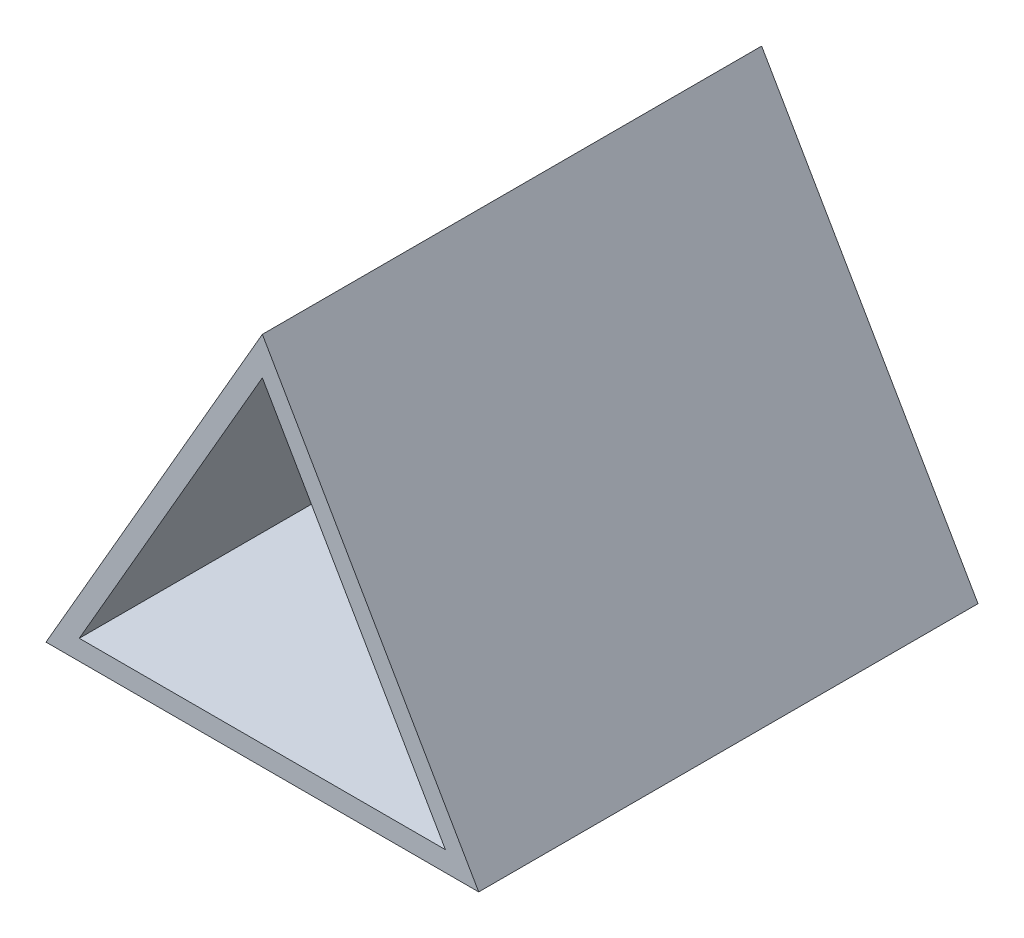
ISO-10303-21;
HEADER;
FILE_DESCRIPTION(('STEP AP214'),'2;1');
FILE_NAME('part.step','',(''),(''),'','','');
FILE_SCHEMA(('AUTOMOTIVE_DESIGN { 1 0 10303 214 1 1 1 1 }'));
ENDSEC;
DATA;
#1=APPLICATION_CONTEXT('core data for automotive mechanical design processes');
#2=APPLICATION_PROTOCOL_DEFINITION('international standard','automotive_design',2000,#1);
#3=PRODUCT_CONTEXT('',#1,'mechanical');
#4=PRODUCT('Part','Part','',(#3));
#5=PRODUCT_RELATED_PRODUCT_CATEGORY('part','',(#4));
#6=PRODUCT_DEFINITION_FORMATION('','',#4);
#7=PRODUCT_DEFINITION_CONTEXT('part definition',#1,'design');
#8=PRODUCT_DEFINITION('design','',#6,#7);
#9=PRODUCT_DEFINITION_SHAPE('','',#8);
#10=(LENGTH_UNIT() NAMED_UNIT(*) SI_UNIT(.MILLI.,.METRE.));
#11=(NAMED_UNIT(*) PLANE_ANGLE_UNIT() SI_UNIT($,.RADIAN.));
#12=(NAMED_UNIT(*) SI_UNIT($,.STERADIAN.) SOLID_ANGLE_UNIT());
#13=UNCERTAINTY_MEASURE_WITH_UNIT(LENGTH_MEASURE(1.E-05),#10,'distance_accuracy_value','');
#14=(GEOMETRIC_REPRESENTATION_CONTEXT(3) GLOBAL_UNCERTAINTY_ASSIGNED_CONTEXT((#13)) GLOBAL_UNIT_ASSIGNED_CONTEXT((#10,
#11,#12)) REPRESENTATION_CONTEXT('',''));
#15=CARTESIAN_POINT('',(0.,0.,0.));
#16=DIRECTION('',(0.,0.,1.));
#17=DIRECTION('',(1.,0.,0.));
#18=AXIS2_PLACEMENT_3D('',#15,#16,#17);
#19=CARTESIAN_POINT('',(-18.4720190424421,10.6648251666298,-75.));
#20=DIRECTION('',(0.866025403784439,-0.5,0.));
#21=DIRECTION('',(0.5,0.866025403784439,0.));
#22=AXIS2_PLACEMENT_3D('',#19,#20,#21);
#23=PLANE('',#22);
#24=DIRECTION('',(0.5,0.866025403784439,0.));
#25=VECTOR('',#24,1.);
#26=CARTESIAN_POINT('',(-18.4720190424421,10.6648251666298,0.));
#27=LINE('',#26,#25);
#28=CARTESIAN_POINT('',(-30.2753059515698,-9.77906745629198,0.));
#29=VERTEX_POINT('',#28);
#30=CARTESIAN_POINT('',(-2.77530595156984,37.8523297518521,0.));
#31=VERTEX_POINT('',#30);
#32=EDGE_CURVE('E123',#29,#31,#27,.T.);
#33=ORIENTED_EDGE('',*,*,#32,.F.);
#34=DIRECTION('',(0.,0.,1.));
#35=VECTOR('',#34,1.);
#36=CARTESIAN_POINT('',(-30.2753059515698,-9.77906745629198,-75.));
#37=LINE('',#36,#35);
#38=CARTESIAN_POINT('',(-30.2753059515698,-9.77906745629198,-75.));
#39=VERTEX_POINT('',#38);
#40=EDGE_CURVE('E11',#39,#29,#37,.T.);
#41=ORIENTED_EDGE('',*,*,#40,.F.);
#42=DIRECTION('',(0.5,0.866025403784439,0.));
#43=VECTOR('',#42,1.);
#44=CARTESIAN_POINT('',(-18.4720190424421,10.6648251666298,-75.));
#45=LINE('',#44,#43);
#46=CARTESIAN_POINT('',(-2.77530595156984,37.8523297518521,-75.));
#47=VERTEX_POINT('',#46);
#48=EDGE_CURVE('E107',#39,#47,#45,.T.);
#49=ORIENTED_EDGE('',*,*,#48,.T.);
#50=DIRECTION('',(0.,0.,1.));
#51=VECTOR('',#50,1.);
#52=CARTESIAN_POINT('',(-2.77530595156984,37.8523297518521,-75.));
#53=LINE('',#52,#51);
#54=EDGE_CURVE('E96',#47,#31,#53,.T.);
#55=ORIENTED_EDGE('',*,*,#54,.T.);
#56=EDGE_LOOP('',(#33,#41,#49,#55));
#57=FACE_BOUND('',#56,.T.);
#58=ADVANCED_FACE('F37',(#57),#23,.T.);
#59=CARTESIAN_POINT('',(0.,-9.77906745629198,-75.));
#60=DIRECTION('',(0.,1.,0.));
#61=DIRECTION('',(0.,0.,1.));
#62=AXIS2_PLACEMENT_3D('',#59,#60,#61);
#63=PLANE('',#62);
#64=DIRECTION('',(-1.,0.,0.));
#65=VECTOR('',#64,1.);
#66=CARTESIAN_POINT('',(0.,-9.77906745629198,0.));
#67=LINE('',#66,#65);
#68=CARTESIAN_POINT('',(24.7246940484302,-9.77906745629198,0.));
#69=VERTEX_POINT('',#68);
#70=EDGE_CURVE('E126',#69,#29,#67,.T.);
#71=ORIENTED_EDGE('',*,*,#70,.F.);
#72=DIRECTION('',(0.,0.,1.));
#73=VECTOR('',#72,1.);
#74=CARTESIAN_POINT('',(24.7246940484302,-9.77906745629198,-75.));
#75=LINE('',#74,#73);
#76=CARTESIAN_POINT('',(24.7246940484302,-9.77906745629198,-75.));
#77=VERTEX_POINT('',#76);
#78=EDGE_CURVE('E47',#77,#69,#75,.T.);
#79=ORIENTED_EDGE('',*,*,#78,.F.);
#80=DIRECTION('',(-1.,0.,0.));
#81=VECTOR('',#80,1.);
#82=CARTESIAN_POINT('',(0.,-9.77906745629198,-75.));
#83=LINE('',#82,#81);
#84=EDGE_CURVE('E108',#77,#39,#83,.T.);
#85=ORIENTED_EDGE('',*,*,#84,.T.);
#86=ORIENTED_EDGE('',*,*,#40,.T.);
#87=EDGE_LOOP('',(#71,#79,#85,#86));
#88=FACE_BOUND('',#87,.T.);
#89=ADVANCED_FACE('F158',(#88),#63,.T.);
#90=CARTESIAN_POINT('',(-20.9229809367654,12.0798886760909,-75.));
#91=DIRECTION('',(0.866025403784438,-0.500000000000001,0.));
#92=DIRECTION('',(0.500000000000001,0.866025403784438,0.));
#93=AXIS2_PLACEMENT_3D('',#90,#91,#92);
#94=PLANE('',#93);
#95=DIRECTION('',(0.500000000000001,0.866025403784438,0.));
#96=VECTOR('',#95,1.);
#97=CARTESIAN_POINT('',(-20.9229809367654,12.0798886760909,0.));
#98=LINE('',#97,#96);
#99=CARTESIAN_POINT('',(-35.2753059515698,-12.779067456292,0.));
#100=VERTEX_POINT('',#99);
#101=CARTESIAN_POINT('',(-2.7753059515697,43.5125837896966,0.));
#102=VERTEX_POINT('',#101);
#103=EDGE_CURVE('E116',#100,#102,#98,.T.);
#104=ORIENTED_EDGE('',*,*,#103,.T.);
#105=DIRECTION('',(0.,0.,1.));
#106=VECTOR('',#105,1.);
#107=CARTESIAN_POINT('',(-2.7753059515697,43.5125837896966,-75.));
#108=LINE('',#107,#106);
#109=CARTESIAN_POINT('',(-2.7753059515697,43.5125837896966,-75.));
#110=VERTEX_POINT('',#109);
#111=EDGE_CURVE('E103',#110,#102,#108,.T.);
#112=ORIENTED_EDGE('',*,*,#111,.F.);
#113=DIRECTION('',(0.500000000000001,0.866025403784438,0.));
#114=VECTOR('',#113,1.);
#115=CARTESIAN_POINT('',(-20.9229809367654,12.0798886760909,-75.));
#116=LINE('',#115,#114);
#117=CARTESIAN_POINT('',(-35.2753059515698,-12.779067456292,-75.));
#118=VERTEX_POINT('',#117);
#119=EDGE_CURVE('E128',#118,#110,#116,.T.);
#120=ORIENTED_EDGE('',*,*,#119,.F.);
#121=DIRECTION('',(0.,0.,1.));
#122=VECTOR('',#121,1.);
#123=CARTESIAN_POINT('',(-35.2753059515698,-12.779067456292,-75.));
#124=LINE('',#123,#122);
#125=EDGE_CURVE('E41',#118,#100,#124,.T.);
#126=ORIENTED_EDGE('',*,*,#125,.T.);
#127=EDGE_LOOP('',(#104,#112,#120,#126));
#128=FACE_BOUND('',#127,.T.);
#129=ADVANCED_FACE('F39',(#128),#94,.F.);
#130=CARTESIAN_POINT('',(16.7600220094108,9.67640321875733,-75.));
#131=DIRECTION('',(-0.866025403784439,-0.499999999999999,0.));
#132=DIRECTION('',(0.499999999999999,-0.86602540378444,0.));
#133=AXIS2_PLACEMENT_3D('',#130,#131,#132);
#134=PLANE('',#133);
#135=DIRECTION('',(0.499999999999999,-0.86602540378444,0.));
#136=VECTOR('',#135,1.);
#137=CARTESIAN_POINT('',(16.7600220094108,9.67640321875733,0.));
#138=LINE('',#137,#136);
#139=CARTESIAN_POINT('',(29.7246940484302,-12.7790674562919,0.));
#140=VERTEX_POINT('',#139);
#141=EDGE_CURVE('E121',#102,#140,#138,.T.);
#142=ORIENTED_EDGE('',*,*,#141,.T.);
#143=DIRECTION('',(0.,0.,1.));
#144=VECTOR('',#143,1.);
#145=CARTESIAN_POINT('',(29.7246940484302,-12.7790674562919,-75.));
#146=LINE('',#145,#144);
#147=CARTESIAN_POINT('',(29.7246940484302,-12.7790674562919,-75.));
#148=VERTEX_POINT('',#147);
#149=EDGE_CURVE('E132',#148,#140,#146,.T.);
#150=ORIENTED_EDGE('',*,*,#149,.F.);
#151=DIRECTION('',(0.499999999999999,-0.86602540378444,0.));
#152=VECTOR('',#151,1.);
#153=CARTESIAN_POINT('',(16.7600220094108,9.67640321875733,-75.));
#154=LINE('',#153,#152);
#155=EDGE_CURVE('E110',#110,#148,#154,.T.);
#156=ORIENTED_EDGE('',*,*,#155,.F.);
#157=ORIENTED_EDGE('',*,*,#111,.T.);
#158=EDGE_LOOP('',(#142,#150,#156,#157));
#159=FACE_BOUND('',#158,.T.);
#160=ADVANCED_FACE('F146',(#159),#134,.F.);
#161=CARTESIAN_POINT('',(0.,-12.779067456292,-75.));
#162=DIRECTION('',(0.,1.,0.));
#163=DIRECTION('',(-1.,0.,0.));
#164=AXIS2_PLACEMENT_3D('',#161,#162,#163);
#165=PLANE('',#164);
#166=DIRECTION('',(-1.,0.,0.));
#167=VECTOR('',#166,1.);
#168=CARTESIAN_POINT('',(0.,-12.779067456292,0.));
#169=LINE('',#168,#167);
#170=EDGE_CURVE('E119',#140,#100,#169,.T.);
#171=ORIENTED_EDGE('',*,*,#170,.T.);
#172=ORIENTED_EDGE('',*,*,#125,.F.);
#173=DIRECTION('',(-1.,0.,0.));
#174=VECTOR('',#173,1.);
#175=CARTESIAN_POINT('',(0.,-12.779067456292,-75.));
#176=LINE('',#175,#174);
#177=EDGE_CURVE('E89',#148,#118,#176,.T.);
#178=ORIENTED_EDGE('',*,*,#177,.F.);
#179=ORIENTED_EDGE('',*,*,#149,.T.);
#180=EDGE_LOOP('',(#171,#172,#178,#179));
#181=FACE_BOUND('',#180,.T.);
#182=ADVANCED_FACE('F155',(#181),#165,.F.);
#183=CARTESIAN_POINT('',(14.3090601150874,8.26133970929622,-75.));
#184=DIRECTION('',(-0.866025403784439,-0.5,0.));
#185=DIRECTION('',(0.5,-0.866025403784439,0.));
#186=AXIS2_PLACEMENT_3D('',#183,#184,#185);
#187=PLANE('',#186);
#188=DIRECTION('',(0.5,-0.866025403784439,0.));
#189=VECTOR('',#188,1.);
#190=CARTESIAN_POINT('',(14.3090601150874,8.26133970929622,0.));
#191=LINE('',#190,#189);
#192=EDGE_CURVE('E101',#31,#69,#191,.T.);
#193=ORIENTED_EDGE('',*,*,#192,.F.);
#194=ORIENTED_EDGE('',*,*,#54,.F.);
#195=DIRECTION('',(0.5,-0.866025403784439,0.));
#196=VECTOR('',#195,1.);
#197=CARTESIAN_POINT('',(14.3090601150874,8.26133970929622,-75.));
#198=LINE('',#197,#196);
#199=EDGE_CURVE('E99',#47,#77,#198,.T.);
#200=ORIENTED_EDGE('',*,*,#199,.T.);
#201=ORIENTED_EDGE('',*,*,#78,.T.);
#202=EDGE_LOOP('',(#193,#194,#200,#201));
#203=FACE_BOUND('',#202,.T.);
#204=ADVANCED_FACE('F98',(#203),#187,.T.);
#205=CARTESIAN_POINT('',(0.,0.,-75.));
#206=DIRECTION('',(0.,0.,1.));
#207=DIRECTION('',(1.,0.,0.));
#208=AXIS2_PLACEMENT_3D('',#205,#206,#207);
#209=PLANE('',#208);
#210=ORIENTED_EDGE('',*,*,#119,.T.);
#211=ORIENTED_EDGE('',*,*,#155,.T.);
#212=ORIENTED_EDGE('',*,*,#177,.T.);
#213=EDGE_LOOP('',(#210,#211,#212));
#214=FACE_BOUND('',#213,.T.);
#215=ORIENTED_EDGE('',*,*,#48,.F.);
#216=ORIENTED_EDGE('',*,*,#84,.F.);
#217=ORIENTED_EDGE('',*,*,#199,.F.);
#218=EDGE_LOOP('',(#215,#216,#217));
#219=FACE_BOUND('',#218,.T.);
#220=ADVANCED_FACE('F106',(#214,#219),#209,.F.);
#221=CARTESIAN_POINT('',(0.,0.,0.));
#222=DIRECTION('',(0.,0.,1.));
#223=DIRECTION('',(1.,0.,0.));
#224=AXIS2_PLACEMENT_3D('',#221,#222,#223);
#225=PLANE('',#224);
#226=ORIENTED_EDGE('',*,*,#103,.F.);
#227=ORIENTED_EDGE('',*,*,#170,.F.);
#228=ORIENTED_EDGE('',*,*,#141,.F.);
#229=EDGE_LOOP('',(#226,#227,#228));
#230=FACE_BOUND('',#229,.T.);
#231=ORIENTED_EDGE('',*,*,#32,.T.);
#232=ORIENTED_EDGE('',*,*,#192,.T.);
#233=ORIENTED_EDGE('',*,*,#70,.T.);
#234=EDGE_LOOP('',(#231,#232,#233));
#235=FACE_BOUND('',#234,.T.);
#236=ADVANCED_FACE('F143',(#230,#235),#225,.T.);
#237=CLOSED_SHELL('',(#58,#89,#129,#160,#182,#204,#220,#236));
#238=MANIFOLD_SOLID_BREP('B2',#237);
#239=ADVANCED_BREP_SHAPE_REPRESENTATION('',(#18,#238),#14);
#240=SHAPE_DEFINITION_REPRESENTATION(#9,#239);
ENDSEC;
END-ISO-10303-21;
